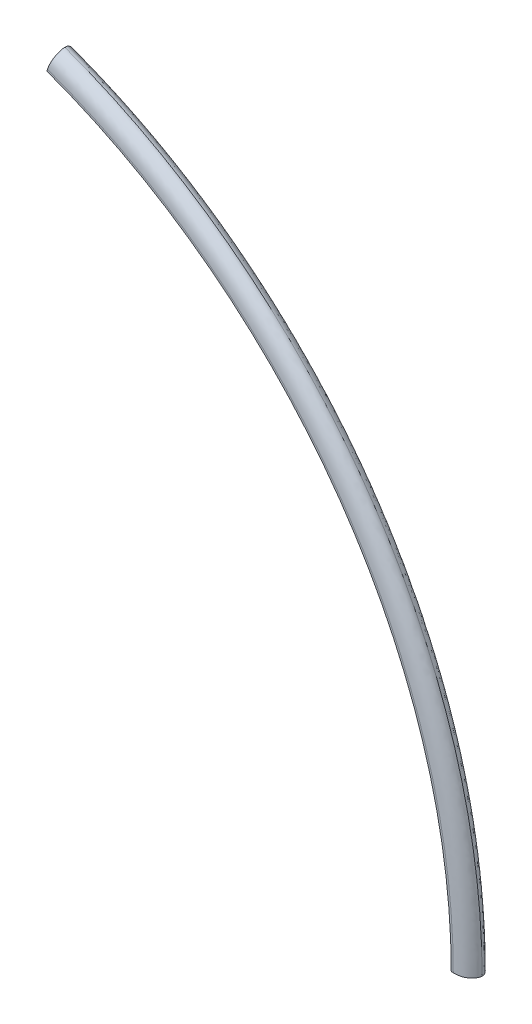
ISO-10303-21;
HEADER;
FILE_DESCRIPTION(('STEP AP214'),'2;1');
FILE_NAME('part.step','',(''),(''),'','','');
FILE_SCHEMA(('AUTOMOTIVE_DESIGN { 1 0 10303 214 1 1 1 1 }'));
ENDSEC;
DATA;
#1=APPLICATION_CONTEXT('core data for automotive mechanical design processes');
#2=APPLICATION_PROTOCOL_DEFINITION('international standard','automotive_design',2000,#1);
#3=PRODUCT_CONTEXT('',#1,'mechanical');
#4=PRODUCT('Part','Part','',(#3));
#5=PRODUCT_RELATED_PRODUCT_CATEGORY('part','',(#4));
#6=PRODUCT_DEFINITION_FORMATION('','',#4);
#7=PRODUCT_DEFINITION_CONTEXT('part definition',#1,'design');
#8=PRODUCT_DEFINITION('design','',#6,#7);
#9=PRODUCT_DEFINITION_SHAPE('','',#8);
#10=(LENGTH_UNIT() NAMED_UNIT(*) SI_UNIT(.MILLI.,.METRE.));
#11=(NAMED_UNIT(*) PLANE_ANGLE_UNIT() SI_UNIT($,.RADIAN.));
#12=(NAMED_UNIT(*) SI_UNIT($,.STERADIAN.) SOLID_ANGLE_UNIT());
#13=UNCERTAINTY_MEASURE_WITH_UNIT(LENGTH_MEASURE(1.E-05),#10,'distance_accuracy_value','');
#14=(GEOMETRIC_REPRESENTATION_CONTEXT(3) GLOBAL_UNCERTAINTY_ASSIGNED_CONTEXT((#13)) GLOBAL_UNIT_ASSIGNED_CONTEXT((#10,
#11,#12)) REPRESENTATION_CONTEXT('',''));
#15=CARTESIAN_POINT('',(0.,0.,0.));
#16=DIRECTION('',(0.,0.,1.));
#17=DIRECTION('',(1.,0.,0.));
#18=AXIS2_PLACEMENT_3D('',#15,#16,#17);
#19=CARTESIAN_POINT('',(218.182272289685,0.,-2.89767586449693));
#20=DIRECTION('',(0.,1.,0.));
#21=DIRECTION('',(0.,0.,1.));
#22=AXIS2_PLACEMENT_3D('',#19,#20,#21);
#23=PLANE('',#22);
#24=DIRECTION('',(0.,0.,1.));
#25=VECTOR('',#24,1.);
#26=CARTESIAN_POINT('',(212.65,0.,3.));
#27=LINE('',#26,#25);
#28=CARTESIAN_POINT('',(212.65,0.,-3.));
#29=VERTEX_POINT('',#28);
#30=CARTESIAN_POINT('',(212.65,0.,3.));
#31=VERTEX_POINT('',#30);
#32=EDGE_CURVE('E72',#29,#31,#27,.T.);
#33=ORIENTED_EDGE('',*,*,#32,.F.);
#34=DIRECTION('',(-1.,0.,0.));
#35=VECTOR('',#34,1.);
#36=CARTESIAN_POINT('',(213.35,0.,-3.));
#37=LINE('',#36,#35);
#38=CARTESIAN_POINT('',(213.35,0.,-3.));
#39=VERTEX_POINT('',#38);
#40=EDGE_CURVE('E77',#39,#29,#37,.T.);
#41=ORIENTED_EDGE('',*,*,#40,.F.);
#42=DIRECTION('',(0.,0.,1.));
#43=VECTOR('',#42,1.);
#44=CARTESIAN_POINT('',(213.35,0.,-3.));
#45=LINE('',#44,#43);
#46=CARTESIAN_POINT('',(213.35,0.,-4.));
#47=VERTEX_POINT('',#46);
#48=EDGE_CURVE('E176',#47,#39,#45,.T.);
#49=ORIENTED_EDGE('',*,*,#48,.F.);
#50=DIRECTION('',(-1.,0.,0.));
#51=VECTOR('',#50,1.);
#52=CARTESIAN_POINT('',(214.05,0.,-4.));
#53=LINE('',#52,#51);
#54=CARTESIAN_POINT('',(214.05,0.,-4.));
#55=VERTEX_POINT('',#54);
#56=EDGE_CURVE('E160',#55,#47,#53,.T.);
#57=ORIENTED_EDGE('',*,*,#56,.F.);
#58=CARTESIAN_POINT('',(220.05,0.,0.));
#59=CARTESIAN_POINT('',(220.05,0.,-0.890470727152588));
#60=CARTESIAN_POINT('',(218.659846142298,0.,-2.66982856107318));
#61=CARTESIAN_POINT('',(217.166947153819,0.,-4.));
#62=CARTESIAN_POINT('',(214.05,0.,-4.));
#63=B_SPLINE_CURVE_WITH_KNOTS('',3,(#58,#59,#60,#61,#62),.UNSPECIFIED.,.F.,.F.,(4,1,4),(0.,
0.243403574961201,1.),.UNSPECIFIED.);
#64=CARTESIAN_POINT('',(220.05,0.,0.));
#65=VERTEX_POINT('',#64);
#66=EDGE_CURVE('E142',#65,#55,#63,.T.);
#67=ORIENTED_EDGE('',*,*,#66,.F.);
#68=CARTESIAN_POINT('',(214.05,0.,4.));
#69=CARTESIAN_POINT('',(217.166947153819,0.,4.));
#70=CARTESIAN_POINT('',(218.659846142298,0.,2.66982856107318));
#71=CARTESIAN_POINT('',(220.05,0.,0.890470727152588));
#72=CARTESIAN_POINT('',(220.05,0.,0.));
#73=B_SPLINE_CURVE_WITH_KNOTS('',3,(#68,#69,#70,#71,#72),.UNSPECIFIED.,.F.,.F.,(4,1,4),(0.,
0.756596425038799,1.),.UNSPECIFIED.);
#74=CARTESIAN_POINT('',(214.05,0.,4.));
#75=VERTEX_POINT('',#74);
#76=EDGE_CURVE('E131',#75,#65,#73,.T.);
#77=ORIENTED_EDGE('',*,*,#76,.F.);
#78=DIRECTION('',(1.,0.,0.));
#79=VECTOR('',#78,1.);
#80=CARTESIAN_POINT('',(214.05,0.,4.));
#81=LINE('',#80,#79);
#82=CARTESIAN_POINT('',(213.35,0.,4.));
#83=VERTEX_POINT('',#82);
#84=EDGE_CURVE('E110',#83,#75,#81,.T.);
#85=ORIENTED_EDGE('',*,*,#84,.F.);
#86=DIRECTION('',(0.,0.,1.));
#87=VECTOR('',#86,1.);
#88=CARTESIAN_POINT('',(213.35,0.,4.));
#89=LINE('',#88,#87);
#90=CARTESIAN_POINT('',(213.35,0.,3.));
#91=VERTEX_POINT('',#90);
#92=EDGE_CURVE('E108',#91,#83,#89,.T.);
#93=ORIENTED_EDGE('',*,*,#92,.F.);
#94=DIRECTION('',(1.,0.,0.));
#95=VECTOR('',#94,1.);
#96=CARTESIAN_POINT('',(213.35,0.,3.));
#97=LINE('',#96,#95);
#98=EDGE_CURVE('E66',#31,#91,#97,.T.);
#99=ORIENTED_EDGE('',*,*,#98,.F.);
#100=EDGE_LOOP('',(#33,#41,#49,#57,#67,#77,#85,#93,#99));
#101=FACE_BOUND('',#100,.T.);
#102=ADVANCED_FACE('F35',(#101),#23,.F.);
#103=CARTESIAN_POINT('',(74.6227320396374,205.024271256919,-2.89767586449693));
#104=DIRECTION('',(-0.939692620785909,0.342020143325666,0.));
#105=DIRECTION('',(0.,0.,1.));
#106=AXIS2_PLACEMENT_3D('',#103,#104,#105);
#107=PLANE('',#106);
#108=DIRECTION('',(0.,0.,1.));
#109=VECTOR('',#108,1.);
#110=CARTESIAN_POINT('',(72.7305834782028,199.825635810124,3.));
#111=LINE('',#110,#109);
#112=CARTESIAN_POINT('',(72.7305834782028,199.825635810124,-3.));
#113=VERTEX_POINT('',#112);
#114=CARTESIAN_POINT('',(72.7305834782028,199.825635810124,3.));
#115=VERTEX_POINT('',#114);
#116=EDGE_CURVE('E48',#113,#115,#111,.T.);
#117=ORIENTED_EDGE('',*,*,#116,.T.);
#118=DIRECTION('',(0.342020143325666,0.939692620785909,0.));
#119=VECTOR('',#118,1.);
#120=CARTESIAN_POINT('',(72.9699975785308,200.483420644674,3.));
#121=LINE('',#120,#119);
#122=CARTESIAN_POINT('',(72.9699975785308,200.483420644674,3.));
#123=VERTEX_POINT('',#122);
#124=EDGE_CURVE('E11',#115,#123,#121,.T.);
#125=ORIENTED_EDGE('',*,*,#124,.T.);
#126=DIRECTION('',(0.,0.,1.));
#127=VECTOR('',#126,1.);
#128=CARTESIAN_POINT('',(72.9699975785308,200.483420644674,4.));
#129=LINE('',#128,#127);
#130=CARTESIAN_POINT('',(72.9699975785308,200.483420644674,4.));
#131=VERTEX_POINT('',#130);
#132=EDGE_CURVE('E124',#123,#131,#129,.T.);
#133=ORIENTED_EDGE('',*,*,#132,.T.);
#134=DIRECTION('',(0.342020143325666,0.939692620785909,0.));
#135=VECTOR('',#134,1.);
#136=CARTESIAN_POINT('',(73.2094116788587,201.141205479224,4.));
#137=LINE('',#136,#135);
#138=CARTESIAN_POINT('',(73.2094116788587,201.141205479224,4.));
#139=VERTEX_POINT('',#138);
#140=EDGE_CURVE('E132',#131,#139,#137,.T.);
#141=ORIENTED_EDGE('',*,*,#140,.T.);
#142=CARTESIAN_POINT('',(73.2094116788587,201.141205479224,4.));
#143=CARTESIAN_POINT('',(74.2754703911465,204.070177719047,4.));
#144=CARTESIAN_POINT('',(74.7860719171567,205.4730438821,2.66982856107318));
#145=CARTESIAN_POINT('',(75.2615325388127,206.779361203939,0.890470727152588));
#146=CARTESIAN_POINT('',(75.2615325388127,206.779361203939,0.));
#147=B_SPLINE_CURVE_WITH_KNOTS('',3,(#142,#143,#144,#145,#146),.UNSPECIFIED.,.F.,.F.,(4,1,4),
(0.,0.756596425038799,1.),.UNSPECIFIED.);
#148=CARTESIAN_POINT('',(75.2615325388127,206.779361203939,0.));
#149=VERTEX_POINT('',#148);
#150=EDGE_CURVE('E137',#139,#149,#147,.T.);
#151=ORIENTED_EDGE('',*,*,#150,.T.);
#152=CARTESIAN_POINT('',(75.2615325388127,206.779361203939,0.));
#153=CARTESIAN_POINT('',(75.2615325388127,206.779361203939,-0.890470727152588));
#154=CARTESIAN_POINT('',(74.7860719171567,205.4730438821,-2.66982856107318));
#155=CARTESIAN_POINT('',(74.2754703911465,204.070177719047,-4.));
#156=CARTESIAN_POINT('',(73.2094116788587,201.141205479224,-4.));
#157=B_SPLINE_CURVE_WITH_KNOTS('',3,(#152,#153,#154,#155,#156),.UNSPECIFIED.,.F.,.F.,(4,1,4),
(0.,0.243403574961201,1.),.UNSPECIFIED.);
#158=CARTESIAN_POINT('',(73.2094116788587,201.141205479224,-4.));
#159=VERTEX_POINT('',#158);
#160=EDGE_CURVE('E155',#149,#159,#157,.T.);
#161=ORIENTED_EDGE('',*,*,#160,.T.);
#162=DIRECTION('',(-0.342020143325666,-0.939692620785909,0.));
#163=VECTOR('',#162,1.);
#164=CARTESIAN_POINT('',(73.2094116788587,201.141205479224,-4.));
#165=LINE('',#164,#163);
#166=CARTESIAN_POINT('',(72.9699975785308,200.483420644674,-4.));
#167=VERTEX_POINT('',#166);
#168=EDGE_CURVE('E173',#159,#167,#165,.T.);
#169=ORIENTED_EDGE('',*,*,#168,.T.);
#170=DIRECTION('',(0.,0.,1.));
#171=VECTOR('',#170,1.);
#172=CARTESIAN_POINT('',(72.9699975785308,200.483420644674,-3.));
#173=LINE('',#172,#171);
#174=CARTESIAN_POINT('',(72.9699975785308,200.483420644674,-3.));
#175=VERTEX_POINT('',#174);
#176=EDGE_CURVE('E181',#167,#175,#173,.T.);
#177=ORIENTED_EDGE('',*,*,#176,.T.);
#178=DIRECTION('',(-0.342020143325666,-0.939692620785909,0.));
#179=VECTOR('',#178,1.);
#180=CARTESIAN_POINT('',(72.9699975785308,200.483420644674,-3.));
#181=LINE('',#180,#179);
#182=EDGE_CURVE('E54',#175,#113,#181,.T.);
#183=ORIENTED_EDGE('',*,*,#182,.T.);
#184=EDGE_LOOP('',(#117,#125,#133,#141,#151,#161,#169,#177,#183));
#185=FACE_BOUND('',#184,.T.);
#186=ADVANCED_FACE('F219',(#185),#107,.T.);
#187=CARTESIAN_POINT('',(0.,0.,0.));
#188=DIRECTION('',(0.,0.,1.));
#189=DIRECTION('',(1.,0.,0.));
#190=AXIS2_PLACEMENT_3D('',#187,#188,#189);
#191=CYLINDRICAL_SURFACE('',#190,213.35);
#192=CARTESIAN_POINT('',(0.,0.,4.));
#193=DIRECTION('',(0.,0.,1.));
#194=DIRECTION('',(1.,0.,0.));
#195=AXIS2_PLACEMENT_3D('',#192,#193,#194);
#196=CIRCLE('',#195,213.35);
#197=EDGE_CURVE('E126',#83,#131,#196,.T.);
#198=ORIENTED_EDGE('',*,*,#197,.T.);
#199=ORIENTED_EDGE('',*,*,#132,.F.);
#200=CARTESIAN_POINT('',(0.,0.,3.));
#201=DIRECTION('',(0.,0.,1.));
#202=DIRECTION('',(1.,0.,0.));
#203=AXIS2_PLACEMENT_3D('',#200,#201,#202);
#204=CIRCLE('',#203,213.35);
#205=EDGE_CURVE('E120',#91,#123,#204,.T.);
#206=ORIENTED_EDGE('',*,*,#205,.F.);
#207=ORIENTED_EDGE('',*,*,#92,.T.);
#208=EDGE_LOOP('',(#198,#199,#206,#207));
#209=FACE_BOUND('',#208,.T.);
#210=ADVANCED_FACE('F123',(#209),#191,.F.);
#211=CARTESIAN_POINT('',(214.05,0.,4.));
#212=DIRECTION('',(0.,0.,1.));
#213=DIRECTION('',(1.,0.,0.));
#214=AXIS2_PLACEMENT_3D('',#211,#212,#213);
#215=PLANE('',#214);
#216=CARTESIAN_POINT('',(0.,0.,4.));
#217=DIRECTION('',(0.,0.,1.));
#218=DIRECTION('',(1.,0.,0.));
#219=AXIS2_PLACEMENT_3D('',#216,#217,#218);
#220=CIRCLE('',#219,214.05);
#221=EDGE_CURVE('E134',#75,#139,#220,.T.);
#222=ORIENTED_EDGE('',*,*,#221,.T.);
#223=ORIENTED_EDGE('',*,*,#140,.F.);
#224=ORIENTED_EDGE('',*,*,#197,.F.);
#225=ORIENTED_EDGE('',*,*,#84,.T.);
#226=EDGE_LOOP('',(#222,#223,#224,#225));
#227=FACE_BOUND('',#226,.T.);
#228=ADVANCED_FACE('F218',(#227),#215,.T.);
#229=CARTESIAN_POINT('',(214.05,0.,4.));
#230=CARTESIAN_POINT('',(214.05,93.0704210575784,4.));
#231=CARTESIAN_POINT('',(160.666999560103,169.309246729731,4.));
#232=CARTESIAN_POINT('',(73.2094116788587,201.141205479224,4.));
#233=CARTESIAN_POINT('',(217.166947153819,0.,4.));
#234=CARTESIAN_POINT('',(217.166947153819,94.4256912468808,4.));
#235=CARTESIAN_POINT('',(163.006595668449,171.774689265164,4.));
#236=CARTESIAN_POINT('',(74.2754703911465,204.070177719047,4.));
#237=CARTESIAN_POINT('',(218.659846142298,0.,2.66982856107318));
#238=CARTESIAN_POINT('',(218.659846142298,95.0748140567576,2.66982856107318));
#239=CARTESIAN_POINT('',(164.127173108884,172.955542351746,2.66982856107318));
#240=CARTESIAN_POINT('',(74.7860719171567,205.4730438821,2.66982856107318));
#241=CARTESIAN_POINT('',(220.05,0.,0.890470727152588));
#242=CARTESIAN_POINT('',(220.05,95.6792625728574,0.890470727152588));
#243=CARTESIAN_POINT('',(165.170629540764,174.055126105477,0.890470727152588));
#244=CARTESIAN_POINT('',(75.2615325388127,206.779361203939,0.890470727152588));
#245=CARTESIAN_POINT('',(220.05,0.,0.));
#246=CARTESIAN_POINT('',(220.05,95.6792625728574,0.));
#247=CARTESIAN_POINT('',(165.170629540764,174.055126105477,0.));
#248=CARTESIAN_POINT('',(75.2615325388127,206.779361203939,0.));
#249=(BOUNDED_SURFACE() B_SPLINE_SURFACE(3,3,((#229,#230,#231,#232),(#233,#234,#235,#236),(#237,
#238,#239,#240),(#241,#242,#243,#244),(#245,#246,#247,#248)),.UNSPECIFIED.,.F.,.F.,
.F.) B_SPLINE_SURFACE_WITH_KNOTS((4,1,4),(4,4),(0.,0.756596425038799,1.),(0.,1.),
.UNSPECIFIED.) GEOMETRIC_REPRESENTATION_ITEM() RATIONAL_B_SPLINE_SURFACE(((1.,0.879434696192661,
0.879434696192661,1.),(1.,0.879434696192661,0.879434696192661,1.),(1.,0.879434696192661,
0.879434696192661,1.),(1.,0.879434696192661,0.879434696192661,1.),(1.,0.879434696192661,
0.879434696192661,1.))) REPRESENTATION_ITEM('') SURFACE());
#250=CARTESIAN_POINT('',(0.,0.,0.));
#251=DIRECTION('',(0.,0.,1.));
#252=DIRECTION('',(1.,0.,0.));
#253=AXIS2_PLACEMENT_3D('',#250,#251,#252);
#254=CIRCLE('',#253,220.05);
#255=EDGE_CURVE('E149',#65,#149,#254,.T.);
#256=ORIENTED_EDGE('',*,*,#255,.T.);
#257=ORIENTED_EDGE('',*,*,#150,.F.);
#258=ORIENTED_EDGE('',*,*,#221,.F.);
#259=ORIENTED_EDGE('',*,*,#76,.T.);
#260=EDGE_LOOP('',(#256,#257,#258,#259));
#261=FACE_BOUND('',#260,.T.);
#262=ADVANCED_FACE('F214',(#261),#249,.T.);
#263=CARTESIAN_POINT('',(220.05,0.,0.));
#264=CARTESIAN_POINT('',(220.05,95.6792625728574,0.));
#265=CARTESIAN_POINT('',(165.170629540764,174.055126105477,0.));
#266=CARTESIAN_POINT('',(75.2615325388127,206.779361203939,0.));
#267=CARTESIAN_POINT('',(220.05,0.,-0.890470727152588));
#268=CARTESIAN_POINT('',(220.05,95.6792625728574,-0.890470727152588));
#269=CARTESIAN_POINT('',(165.170629540764,174.055126105477,-0.890470727152588));
#270=CARTESIAN_POINT('',(75.2615325388127,206.779361203939,-0.890470727152588));
#271=CARTESIAN_POINT('',(218.659846142298,0.,-2.66982856107318));
#272=CARTESIAN_POINT('',(218.659846142298,95.0748140567576,-2.66982856107318));
#273=CARTESIAN_POINT('',(164.127173108884,172.955542351746,-2.66982856107318));
#274=CARTESIAN_POINT('',(74.7860719171567,205.4730438821,-2.66982856107318));
#275=CARTESIAN_POINT('',(217.166947153819,0.,-4.));
#276=CARTESIAN_POINT('',(217.166947153819,94.4256912468808,-4.));
#277=CARTESIAN_POINT('',(163.006595668449,171.774689265164,-4.));
#278=CARTESIAN_POINT('',(74.2754703911465,204.070177719047,-4.));
#279=CARTESIAN_POINT('',(214.05,0.,-4.));
#280=CARTESIAN_POINT('',(214.05,93.0704210575784,-4.));
#281=CARTESIAN_POINT('',(160.666999560103,169.309246729731,-4.));
#282=CARTESIAN_POINT('',(73.2094116788587,201.141205479224,-4.));
#283=(BOUNDED_SURFACE() B_SPLINE_SURFACE(3,3,((#263,#264,#265,#266),(#267,#268,#269,#270),(#271,
#272,#273,#274),(#275,#276,#277,#278),(#279,#280,#281,#282)),.UNSPECIFIED.,.F.,.F.,
.F.) B_SPLINE_SURFACE_WITH_KNOTS((4,1,4),(4,4),(0.,0.243403574961201,1.),(0.,1.),
.UNSPECIFIED.) GEOMETRIC_REPRESENTATION_ITEM() RATIONAL_B_SPLINE_SURFACE(((1.,0.879434696192661,
0.879434696192661,1.),(1.,0.879434696192661,0.879434696192661,1.),(1.,0.879434696192661,
0.879434696192661,1.),(1.,0.879434696192661,0.879434696192661,1.),(1.,0.879434696192661,
0.879434696192661,1.))) REPRESENTATION_ITEM('') SURFACE());
#284=CARTESIAN_POINT('',(0.,0.,-4.));
#285=DIRECTION('',(0.,0.,1.));
#286=DIRECTION('',(1.,0.,0.));
#287=AXIS2_PLACEMENT_3D('',#284,#285,#286);
#288=CIRCLE('',#287,214.05);
#289=EDGE_CURVE('E167',#55,#159,#288,.T.);
#290=ORIENTED_EDGE('',*,*,#289,.T.);
#291=ORIENTED_EDGE('',*,*,#160,.F.);
#292=ORIENTED_EDGE('',*,*,#255,.F.);
#293=ORIENTED_EDGE('',*,*,#66,.T.);
#294=EDGE_LOOP('',(#290,#291,#292,#293));
#295=FACE_BOUND('',#294,.T.);
#296=ADVANCED_FACE('F210',(#295),#283,.T.);
#297=CARTESIAN_POINT('',(214.05,0.,-4.));
#298=DIRECTION('',(0.,0.,-1.));
#299=DIRECTION('',(-1.,0.,0.));
#300=AXIS2_PLACEMENT_3D('',#297,#298,#299);
#301=PLANE('',#300);
#302=CARTESIAN_POINT('',(0.,0.,-4.));
#303=DIRECTION('',(0.,0.,1.));
#304=DIRECTION('',(1.,0.,0.));
#305=AXIS2_PLACEMENT_3D('',#302,#303,#304);
#306=CIRCLE('',#305,213.35);
#307=EDGE_CURVE('E178',#47,#167,#306,.T.);
#308=ORIENTED_EDGE('',*,*,#307,.T.);
#309=ORIENTED_EDGE('',*,*,#168,.F.);
#310=ORIENTED_EDGE('',*,*,#289,.F.);
#311=ORIENTED_EDGE('',*,*,#56,.T.);
#312=EDGE_LOOP('',(#308,#309,#310,#311));
#313=FACE_BOUND('',#312,.T.);
#314=ADVANCED_FACE('F206',(#313),#301,.T.);
#315=CARTESIAN_POINT('',(0.,0.,0.));
#316=DIRECTION('',(0.,0.,1.));
#317=DIRECTION('',(1.,0.,0.));
#318=AXIS2_PLACEMENT_3D('',#315,#316,#317);
#319=CYLINDRICAL_SURFACE('',#318,213.35);
#320=CARTESIAN_POINT('',(0.,0.,-3.));
#321=DIRECTION('',(0.,0.,1.));
#322=DIRECTION('',(1.,0.,0.));
#323=AXIS2_PLACEMENT_3D('',#320,#321,#322);
#324=CIRCLE('',#323,213.35);
#325=EDGE_CURVE('E184',#39,#175,#324,.T.);
#326=ORIENTED_EDGE('',*,*,#325,.T.);
#327=ORIENTED_EDGE('',*,*,#176,.F.);
#328=ORIENTED_EDGE('',*,*,#307,.F.);
#329=ORIENTED_EDGE('',*,*,#48,.T.);
#330=EDGE_LOOP('',(#326,#327,#328,#329));
#331=FACE_BOUND('',#330,.T.);
#332=ADVANCED_FACE('F202',(#331),#319,.F.);
#333=CARTESIAN_POINT('',(213.35,0.,-3.));
#334=DIRECTION('',(0.,0.,-1.));
#335=DIRECTION('',(-1.,0.,0.));
#336=AXIS2_PLACEMENT_3D('',#333,#334,#335);
#337=PLANE('',#336);
#338=CARTESIAN_POINT('',(0.,0.,-3.));
#339=DIRECTION('',(0.,0.,1.));
#340=DIRECTION('',(1.,0.,0.));
#341=AXIS2_PLACEMENT_3D('',#338,#339,#340);
#342=CIRCLE('',#341,212.65);
#343=EDGE_CURVE('E189',#29,#113,#342,.T.);
#344=ORIENTED_EDGE('',*,*,#343,.T.);
#345=ORIENTED_EDGE('',*,*,#182,.F.);
#346=ORIENTED_EDGE('',*,*,#325,.F.);
#347=ORIENTED_EDGE('',*,*,#40,.T.);
#348=EDGE_LOOP('',(#344,#345,#346,#347));
#349=FACE_BOUND('',#348,.T.);
#350=ADVANCED_FACE('F198',(#349),#337,.T.);
#351=CARTESIAN_POINT('',(0.,0.,0.));
#352=DIRECTION('',(0.,0.,1.));
#353=DIRECTION('',(1.,0.,0.));
#354=AXIS2_PLACEMENT_3D('',#351,#352,#353);
#355=CYLINDRICAL_SURFACE('',#354,212.65);
#356=CARTESIAN_POINT('',(0.,0.,3.));
#357=DIRECTION('',(0.,0.,1.));
#358=DIRECTION('',(1.,0.,0.));
#359=AXIS2_PLACEMENT_3D('',#356,#357,#358);
#360=CIRCLE('',#359,212.65);
#361=EDGE_CURVE('E42',#31,#115,#360,.T.);
#362=ORIENTED_EDGE('',*,*,#361,.T.);
#363=ORIENTED_EDGE('',*,*,#116,.F.);
#364=ORIENTED_EDGE('',*,*,#343,.F.);
#365=ORIENTED_EDGE('',*,*,#32,.T.);
#366=EDGE_LOOP('',(#362,#363,#364,#365));
#367=FACE_BOUND('',#366,.T.);
#368=ADVANCED_FACE('F195',(#367),#355,.F.);
#369=CARTESIAN_POINT('',(213.35,0.,3.));
#370=DIRECTION('',(0.,0.,1.));
#371=DIRECTION('',(1.,0.,0.));
#372=AXIS2_PLACEMENT_3D('',#369,#370,#371);
#373=PLANE('',#372);
#374=ORIENTED_EDGE('',*,*,#124,.F.);
#375=ORIENTED_EDGE('',*,*,#361,.F.);
#376=ORIENTED_EDGE('',*,*,#98,.T.);
#377=ORIENTED_EDGE('',*,*,#205,.T.);
#378=EDGE_LOOP('',(#374,#375,#376,#377));
#379=FACE_BOUND('',#378,.T.);
#380=ADVANCED_FACE('F119',(#379),#373,.T.);
#381=CLOSED_SHELL('',(#102,#186,#210,#228,#262,#296,#314,#332,#350,#368,#380));
#382=MANIFOLD_SOLID_BREP('B2',#381);
#383=ADVANCED_BREP_SHAPE_REPRESENTATION('',(#18,#382),#14);
#384=SHAPE_DEFINITION_REPRESENTATION(#9,#383);
ENDSEC;
END-ISO-10303-21;
